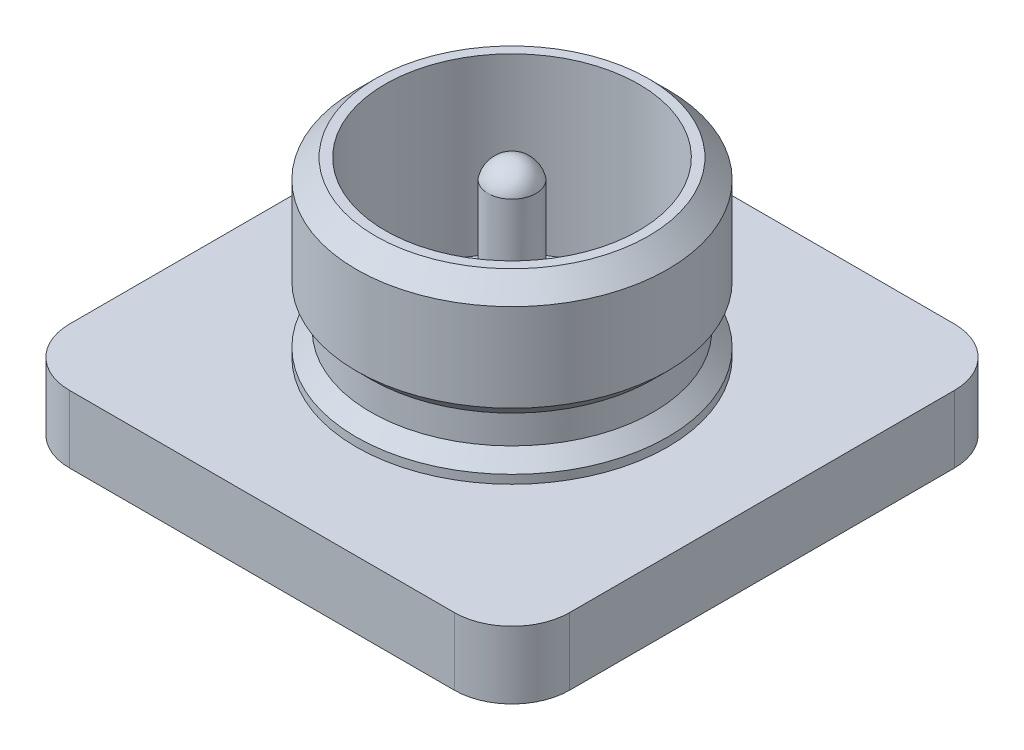
ISO-10303-21;
HEADER;
FILE_DESCRIPTION(('STEP AP214'),'2;1');
FILE_NAME('part.step','',(''),(''),'','','');
FILE_SCHEMA(('AUTOMOTIVE_DESIGN { 1 0 10303 214 1 1 1 1 }'));
ENDSEC;
DATA;
#1=APPLICATION_CONTEXT('core data for automotive mechanical design processes');
#2=APPLICATION_PROTOCOL_DEFINITION('international standard','automotive_design',2000,#1);
#3=PRODUCT_CONTEXT('',#1,'mechanical');
#4=PRODUCT('Part','Part','',(#3));
#5=PRODUCT_RELATED_PRODUCT_CATEGORY('part','',(#4));
#6=PRODUCT_DEFINITION_FORMATION('','',#4);
#7=PRODUCT_DEFINITION_CONTEXT('part definition',#1,'design');
#8=PRODUCT_DEFINITION('design','',#6,#7);
#9=PRODUCT_DEFINITION_SHAPE('','',#8);
#10=(LENGTH_UNIT() NAMED_UNIT(*) SI_UNIT(.MILLI.,.METRE.));
#11=(NAMED_UNIT(*) PLANE_ANGLE_UNIT() SI_UNIT($,.RADIAN.));
#12=(NAMED_UNIT(*) SI_UNIT($,.STERADIAN.) SOLID_ANGLE_UNIT());
#13=UNCERTAINTY_MEASURE_WITH_UNIT(LENGTH_MEASURE(1.E-05),#10,'distance_accuracy_value','');
#14=(GEOMETRIC_REPRESENTATION_CONTEXT(3) GLOBAL_UNCERTAINTY_ASSIGNED_CONTEXT((#13)) GLOBAL_UNIT_ASSIGNED_CONTEXT((#10,
#11,#12)) REPRESENTATION_CONTEXT('',''));
#15=CARTESIAN_POINT('',(0.,0.,0.));
#16=DIRECTION('',(0.,0.,1.));
#17=DIRECTION('',(1.,0.,0.));
#18=AXIS2_PLACEMENT_3D('',#15,#16,#17);
#19=CARTESIAN_POINT('',(0.,0.35,0.));
#20=DIRECTION('',(0.,-1.,0.));
#21=DIRECTION('',(0.,0.,-1.));
#22=AXIS2_PLACEMENT_3D('',#19,#20,#21);
#23=PLANE('',#22);
#24=CARTESIAN_POINT('',(0.,0.350000000000003,0.));
#25=DIRECTION('',(0.,-1.,0.));
#26=DIRECTION('',(0.,0.,-1.));
#27=AXIS2_PLACEMENT_3D('',#24,#25,#26);
#28=CIRCLE('',#27,0.659628486758379);
#29=CARTESIAN_POINT('',(0.,0.350000000000003,-0.659628486758379));
#30=VERTEX_POINT('',#29);
#31=EDGE_CURVE('E235',#30,#30,#28,.T.);
#32=ORIENTED_EDGE('',*,*,#31,.F.);
#33=EDGE_LOOP('',(#32));
#34=FACE_BOUND('',#33,.T.);
#35=CARTESIAN_POINT('',(0.,0.35,0.));
#36=DIRECTION('',(0.,-1.,0.));
#37=DIRECTION('',(0.,0.,-1.));
#38=AXIS2_PLACEMENT_3D('',#35,#36,#37);
#39=CIRCLE('',#38,0.125);
#40=CARTESIAN_POINT('',(0.,0.35,-0.125));
#41=VERTEX_POINT('',#40);
#42=EDGE_CURVE('E11',#41,#41,#39,.F.);
#43=ORIENTED_EDGE('',*,*,#42,.F.);
#44=EDGE_LOOP('',(#43));
#45=FACE_BOUND('',#44,.T.);
#46=ADVANCED_FACE('F33',(#34,#45),#23,.F.);
#47=CARTESIAN_POINT('',(1.3,0.35,1.3));
#48=DIRECTION('',(-1.,0.,0.));
#49=DIRECTION('',(0.,0.,1.));
#50=AXIS2_PLACEMENT_3D('',#47,#48,#49);
#51=PLANE('',#50);
#52=DIRECTION('',(0.,0.,-1.));
#53=VECTOR('',#52,1.);
#54=CARTESIAN_POINT('',(1.3,0.35,1.3));
#55=LINE('',#54,#53);
#56=CARTESIAN_POINT('',(1.3,0.35,1.));
#57=VERTEX_POINT('',#56);
#58=CARTESIAN_POINT('',(1.3,0.35,-1.));
#59=VERTEX_POINT('',#58);
#60=EDGE_CURVE('E127',#57,#59,#55,.T.);
#61=ORIENTED_EDGE('',*,*,#60,.F.);
#62=DIRECTION('',(0.,-1.,0.));
#63=VECTOR('',#62,1.);
#64=CARTESIAN_POINT('',(1.3,0.35,1.));
#65=LINE('',#64,#63);
#66=CARTESIAN_POINT('',(1.3,0.,1.));
#67=VERTEX_POINT('',#66);
#68=EDGE_CURVE('E153',#57,#67,#65,.T.);
#69=ORIENTED_EDGE('',*,*,#68,.T.);
#70=DIRECTION('',(0.,0.,-1.));
#71=VECTOR('',#70,1.);
#72=CARTESIAN_POINT('',(1.3,0.,1.3));
#73=LINE('',#72,#71);
#74=CARTESIAN_POINT('',(1.3,0.,-1.));
#75=VERTEX_POINT('',#74);
#76=EDGE_CURVE('E233',#67,#75,#73,.T.);
#77=ORIENTED_EDGE('',*,*,#76,.T.);
#78=DIRECTION('',(0.,-1.,0.));
#79=VECTOR('',#78,1.);
#80=CARTESIAN_POINT('',(1.3,0.35,-1.));
#81=LINE('',#80,#79);
#82=EDGE_CURVE('E151',#75,#59,#81,.F.);
#83=ORIENTED_EDGE('',*,*,#82,.T.);
#84=EDGE_LOOP('',(#61,#69,#77,#83));
#85=FACE_BOUND('',#84,.T.);
#86=ADVANCED_FACE('F197',(#85),#51,.F.);
#87=CARTESIAN_POINT('',(-1.3,0.35,-1.3));
#88=DIRECTION('',(0.,0.,1.));
#89=DIRECTION('',(1.,0.,0.));
#90=AXIS2_PLACEMENT_3D('',#87,#88,#89);
#91=PLANE('',#90);
#92=DIRECTION('',(-1.,0.,0.));
#93=VECTOR('',#92,1.);
#94=CARTESIAN_POINT('',(-1.3,0.35,-1.3));
#95=LINE('',#94,#93);
#96=CARTESIAN_POINT('',(1.,0.35,-1.3));
#97=VERTEX_POINT('',#96);
#98=CARTESIAN_POINT('',(-1.,0.35,-1.3));
#99=VERTEX_POINT('',#98);
#100=EDGE_CURVE('E130',#97,#99,#95,.T.);
#101=ORIENTED_EDGE('',*,*,#100,.F.);
#102=DIRECTION('',(0.,-1.,0.));
#103=VECTOR('',#102,1.);
#104=CARTESIAN_POINT('',(1.,0.35,-1.3));
#105=LINE('',#104,#103);
#106=CARTESIAN_POINT('',(1.,0.,-1.3));
#107=VERTEX_POINT('',#106);
#108=EDGE_CURVE('E157',#97,#107,#105,.T.);
#109=ORIENTED_EDGE('',*,*,#108,.T.);
#110=DIRECTION('',(-1.,0.,0.));
#111=VECTOR('',#110,1.);
#112=CARTESIAN_POINT('',(-1.3,0.,-1.3));
#113=LINE('',#112,#111);
#114=CARTESIAN_POINT('',(-1.,0.,-1.3));
#115=VERTEX_POINT('',#114);
#116=EDGE_CURVE('E132',#107,#115,#113,.T.);
#117=ORIENTED_EDGE('',*,*,#116,.T.);
#118=DIRECTION('',(0.,-1.,0.));
#119=VECTOR('',#118,1.);
#120=CARTESIAN_POINT('',(-1.,0.35,-1.3));
#121=LINE('',#120,#119);
#122=EDGE_CURVE('E49',#115,#99,#121,.F.);
#123=ORIENTED_EDGE('',*,*,#122,.T.);
#124=EDGE_LOOP('',(#101,#109,#117,#123));
#125=FACE_BOUND('',#124,.T.);
#126=ADVANCED_FACE('F204',(#125),#91,.F.);
#127=CARTESIAN_POINT('',(-1.3,0.35,1.3));
#128=DIRECTION('',(1.,0.,0.));
#129=DIRECTION('',(0.,0.,-1.));
#130=AXIS2_PLACEMENT_3D('',#127,#128,#129);
#131=PLANE('',#130);
#132=DIRECTION('',(0.,0.,1.));
#133=VECTOR('',#132,1.);
#134=CARTESIAN_POINT('',(-1.3,0.,1.3));
#135=LINE('',#134,#133);
#136=CARTESIAN_POINT('',(-1.3,0.,-1.));
#137=VERTEX_POINT('',#136);
#138=CARTESIAN_POINT('',(-1.3,0.,1.));
#139=VERTEX_POINT('',#138);
#140=EDGE_CURVE('E128',#137,#139,#135,.T.);
#141=ORIENTED_EDGE('',*,*,#140,.T.);
#142=DIRECTION('',(0.,-1.,0.));
#143=VECTOR('',#142,1.);
#144=CARTESIAN_POINT('',(-1.3,0.35,1.));
#145=LINE('',#144,#143);
#146=CARTESIAN_POINT('',(-1.3,0.35,1.));
#147=VERTEX_POINT('',#146);
#148=EDGE_CURVE('E106',#139,#147,#145,.F.);
#149=ORIENTED_EDGE('',*,*,#148,.T.);
#150=DIRECTION('',(0.,0.,1.));
#151=VECTOR('',#150,1.);
#152=CARTESIAN_POINT('',(-1.3,0.35,1.3));
#153=LINE('',#152,#151);
#154=CARTESIAN_POINT('',(-1.3,0.35,-1.));
#155=VERTEX_POINT('',#154);
#156=EDGE_CURVE('E225',#155,#147,#153,.T.);
#157=ORIENTED_EDGE('',*,*,#156,.F.);
#158=DIRECTION('',(0.,-1.,0.));
#159=VECTOR('',#158,1.);
#160=CARTESIAN_POINT('',(-1.3,0.35,-1.));
#161=LINE('',#160,#159);
#162=EDGE_CURVE('E111',#155,#137,#161,.T.);
#163=ORIENTED_EDGE('',*,*,#162,.T.);
#164=EDGE_LOOP('',(#141,#149,#157,#163));
#165=FACE_BOUND('',#164,.T.);
#166=ADVANCED_FACE('F218',(#165),#131,.F.);
#167=CARTESIAN_POINT('',(-1.3,0.35,1.3));
#168=DIRECTION('',(0.,0.,-1.));
#169=DIRECTION('',(-1.,0.,0.));
#170=AXIS2_PLACEMENT_3D('',#167,#168,#169);
#171=PLANE('',#170);
#172=DIRECTION('',(1.,0.,0.));
#173=VECTOR('',#172,1.);
#174=CARTESIAN_POINT('',(-1.3,0.35,1.3));
#175=LINE('',#174,#173);
#176=CARTESIAN_POINT('',(-1.,0.35,1.3));
#177=VERTEX_POINT('',#176);
#178=CARTESIAN_POINT('',(1.,0.35,1.3));
#179=VERTEX_POINT('',#178);
#180=EDGE_CURVE('E121',#177,#179,#175,.T.);
#181=ORIENTED_EDGE('',*,*,#180,.F.);
#182=DIRECTION('',(0.,-1.,0.));
#183=VECTOR('',#182,1.);
#184=CARTESIAN_POINT('',(-1.,0.35,1.3));
#185=LINE('',#184,#183);
#186=CARTESIAN_POINT('',(-1.,0.,1.3));
#187=VERTEX_POINT('',#186);
#188=EDGE_CURVE('E105',#177,#187,#185,.T.);
#189=ORIENTED_EDGE('',*,*,#188,.T.);
#190=DIRECTION('',(1.,0.,0.));
#191=VECTOR('',#190,1.);
#192=CARTESIAN_POINT('',(-1.3,0.,1.3));
#193=LINE('',#192,#191);
#194=CARTESIAN_POINT('',(1.,0.,1.3));
#195=VERTEX_POINT('',#194);
#196=EDGE_CURVE('E118',#187,#195,#193,.T.);
#197=ORIENTED_EDGE('',*,*,#196,.T.);
#198=DIRECTION('',(0.,-1.,0.));
#199=VECTOR('',#198,1.);
#200=CARTESIAN_POINT('',(1.,0.35,1.3));
#201=LINE('',#200,#199);
#202=EDGE_CURVE('E123',#195,#179,#201,.F.);
#203=ORIENTED_EDGE('',*,*,#202,.T.);
#204=EDGE_LOOP('',(#181,#189,#197,#203));
#205=FACE_BOUND('',#204,.T.);
#206=ADVANCED_FACE('F117',(#205),#171,.F.);
#207=CARTESIAN_POINT('',(0.,0.350000000000003,0.));
#208=DIRECTION('',(0.,-1.,0.));
#209=DIRECTION('',(0.,0.,-1.));
#210=AXIS2_PLACEMENT_3D('',#207,#208,#209);
#211=CIRCLE('',#210,0.809628486758379);
#212=CARTESIAN_POINT('',(0.,0.350000000000003,-0.809628486758379));
#213=VERTEX_POINT('',#212);
#214=EDGE_CURVE('E222',#213,#213,#211,.T.);
#215=ORIENTED_EDGE('',*,*,#214,.T.);
#216=EDGE_LOOP('',(#215));
#217=FACE_BOUND('',#216,.T.);
#218=ORIENTED_EDGE('',*,*,#156,.T.);
#219=CARTESIAN_POINT('',(-1.,0.35,1.));
#220=DIRECTION('',(0.,-1.,0.));
#221=DIRECTION('',(0.,0.,-1.));
#222=AXIS2_PLACEMENT_3D('',#219,#220,#221);
#223=CIRCLE('',#222,0.3);
#224=EDGE_CURVE('E149',#147,#177,#223,.F.);
#225=ORIENTED_EDGE('',*,*,#224,.T.);
#226=ORIENTED_EDGE('',*,*,#180,.T.);
#227=CARTESIAN_POINT('',(1.,0.35,1.));
#228=DIRECTION('',(0.,-1.,0.));
#229=DIRECTION('',(0.,0.,-1.));
#230=AXIS2_PLACEMENT_3D('',#227,#228,#229);
#231=CIRCLE('',#230,0.3);
#232=EDGE_CURVE('E147',#179,#57,#231,.F.);
#233=ORIENTED_EDGE('',*,*,#232,.T.);
#234=ORIENTED_EDGE('',*,*,#60,.T.);
#235=CARTESIAN_POINT('',(1.,0.35,-1.));
#236=DIRECTION('',(0.,-1.,0.));
#237=DIRECTION('',(0.,0.,-1.));
#238=AXIS2_PLACEMENT_3D('',#235,#236,#237);
#239=CIRCLE('',#238,0.3);
#240=EDGE_CURVE('E56',#59,#97,#239,.F.);
#241=ORIENTED_EDGE('',*,*,#240,.T.);
#242=ORIENTED_EDGE('',*,*,#100,.T.);
#243=CARTESIAN_POINT('',(-1.,0.35,-1.));
#244=DIRECTION('',(0.,-1.,0.));
#245=DIRECTION('',(0.,0.,-1.));
#246=AXIS2_PLACEMENT_3D('',#243,#244,#245);
#247=CIRCLE('',#246,0.3);
#248=EDGE_CURVE('E144',#99,#155,#247,.F.);
#249=ORIENTED_EDGE('',*,*,#248,.T.);
#250=EDGE_LOOP('',(#218,#225,#226,#233,#234,#241,#242,#249));
#251=FACE_BOUND('',#250,.T.);
#252=ADVANCED_FACE('F200',(#217,#251),#23,.F.);
#253=CARTESIAN_POINT('',(0.,0.,0.));
#254=DIRECTION('',(0.,-1.,0.));
#255=DIRECTION('',(0.,0.,-1.));
#256=AXIS2_PLACEMENT_3D('',#253,#254,#255);
#257=PLANE('',#256);
#258=CARTESIAN_POINT('',(0.,0.,0.));
#259=DIRECTION('',(0.,-1.,0.));
#260=DIRECTION('',(0.,0.,-1.));
#261=AXIS2_PLACEMENT_3D('',#258,#259,#260);
#262=CIRCLE('',#261,0.125);
#263=CARTESIAN_POINT('',(0.,0.,-0.125));
#264=VERTEX_POINT('',#263);
#265=EDGE_CURVE('E298',#264,#264,#262,.T.);
#266=ORIENTED_EDGE('',*,*,#265,.F.);
#267=EDGE_LOOP('',(#266));
#268=FACE_BOUND('',#267,.T.);
#269=ORIENTED_EDGE('',*,*,#196,.F.);
#270=CARTESIAN_POINT('',(-1.,0.,1.));
#271=DIRECTION('',(0.,-1.,0.));
#272=DIRECTION('',(0.,0.,-1.));
#273=AXIS2_PLACEMENT_3D('',#270,#271,#272);
#274=CIRCLE('',#273,0.3);
#275=EDGE_CURVE('E101',#187,#139,#274,.T.);
#276=ORIENTED_EDGE('',*,*,#275,.T.);
#277=ORIENTED_EDGE('',*,*,#140,.F.);
#278=CARTESIAN_POINT('',(-1.,0.,-1.));
#279=DIRECTION('',(0.,-1.,0.));
#280=DIRECTION('',(0.,0.,-1.));
#281=AXIS2_PLACEMENT_3D('',#278,#279,#280);
#282=CIRCLE('',#281,0.3);
#283=EDGE_CURVE('E122',#137,#115,#282,.T.);
#284=ORIENTED_EDGE('',*,*,#283,.T.);
#285=ORIENTED_EDGE('',*,*,#116,.F.);
#286=CARTESIAN_POINT('',(1.,0.,-1.));
#287=DIRECTION('',(0.,-1.,0.));
#288=DIRECTION('',(0.,0.,-1.));
#289=AXIS2_PLACEMENT_3D('',#286,#287,#288);
#290=CIRCLE('',#289,0.3);
#291=EDGE_CURVE('E138',#107,#75,#290,.T.);
#292=ORIENTED_EDGE('',*,*,#291,.T.);
#293=ORIENTED_EDGE('',*,*,#76,.F.);
#294=CARTESIAN_POINT('',(1.,0.,1.));
#295=DIRECTION('',(0.,-1.,0.));
#296=DIRECTION('',(0.,0.,-1.));
#297=AXIS2_PLACEMENT_3D('',#294,#295,#296);
#298=CIRCLE('',#297,0.3);
#299=EDGE_CURVE('E112',#67,#195,#298,.T.);
#300=ORIENTED_EDGE('',*,*,#299,.T.);
#301=EDGE_LOOP('',(#269,#276,#277,#284,#285,#292,#293,#300));
#302=FACE_BOUND('',#301,.T.);
#303=ADVANCED_FACE('F125',(#268,#302),#257,.T.);
#304=CARTESIAN_POINT('',(-1.,0.35,1.));
#305=DIRECTION('',(0.,-1.,0.));
#306=DIRECTION('',(0.,0.,-1.));
#307=AXIS2_PLACEMENT_3D('',#304,#305,#306);
#308=CYLINDRICAL_SURFACE('',#307,0.3);
#309=ORIENTED_EDGE('',*,*,#224,.F.);
#310=ORIENTED_EDGE('',*,*,#148,.F.);
#311=ORIENTED_EDGE('',*,*,#275,.F.);
#312=ORIENTED_EDGE('',*,*,#188,.F.);
#313=EDGE_LOOP('',(#309,#310,#311,#312));
#314=FACE_BOUND('',#313,.T.);
#315=ADVANCED_FACE('F104',(#314),#308,.T.);
#316=CARTESIAN_POINT('',(1.,0.35,1.));
#317=DIRECTION('',(0.,-1.,0.));
#318=DIRECTION('',(0.,0.,-1.));
#319=AXIS2_PLACEMENT_3D('',#316,#317,#318);
#320=CYLINDRICAL_SURFACE('',#319,0.3);
#321=ORIENTED_EDGE('',*,*,#232,.F.);
#322=ORIENTED_EDGE('',*,*,#202,.F.);
#323=ORIENTED_EDGE('',*,*,#299,.F.);
#324=ORIENTED_EDGE('',*,*,#68,.F.);
#325=EDGE_LOOP('',(#321,#322,#323,#324));
#326=FACE_BOUND('',#325,.T.);
#327=ADVANCED_FACE('F249',(#326),#320,.T.);
#328=CARTESIAN_POINT('',(1.,0.35,-1.));
#329=DIRECTION('',(0.,-1.,0.));
#330=DIRECTION('',(0.,0.,-1.));
#331=AXIS2_PLACEMENT_3D('',#328,#329,#330);
#332=CYLINDRICAL_SURFACE('',#331,0.3);
#333=ORIENTED_EDGE('',*,*,#240,.F.);
#334=ORIENTED_EDGE('',*,*,#82,.F.);
#335=ORIENTED_EDGE('',*,*,#291,.F.);
#336=ORIENTED_EDGE('',*,*,#108,.F.);
#337=EDGE_LOOP('',(#333,#334,#335,#336));
#338=FACE_BOUND('',#337,.T.);
#339=ADVANCED_FACE('F252',(#338),#332,.T.);
#340=CARTESIAN_POINT('',(-1.,0.35,-1.));
#341=DIRECTION('',(0.,-1.,0.));
#342=DIRECTION('',(0.,0.,-1.));
#343=AXIS2_PLACEMENT_3D('',#340,#341,#342);
#344=CYLINDRICAL_SURFACE('',#343,0.3);
#345=ORIENTED_EDGE('',*,*,#248,.F.);
#346=ORIENTED_EDGE('',*,*,#122,.F.);
#347=ORIENTED_EDGE('',*,*,#283,.F.);
#348=ORIENTED_EDGE('',*,*,#162,.F.);
#349=EDGE_LOOP('',(#345,#346,#347,#348));
#350=FACE_BOUND('',#349,.T.);
#351=ADVANCED_FACE('F239',(#350),#344,.T.);
#352=CARTESIAN_POINT('',(0.,-50.,0.));
#353=DIRECTION('',(0.,-1.,0.));
#354=DIRECTION('',(0.,0.,-1.));
#355=AXIS2_PLACEMENT_3D('',#352,#353,#354);
#356=CYLINDRICAL_SURFACE('',#355,0.659628486758379);
#357=ORIENTED_EDGE('',*,*,#31,.T.);
#358=EDGE_LOOP('',(#357));
#359=FACE_BOUND('',#358,.T.);
#360=CARTESIAN_POINT('',(0.,1.25,0.));
#361=DIRECTION('',(0.,-1.,0.));
#362=DIRECTION('',(0.,0.,-1.));
#363=AXIS2_PLACEMENT_3D('',#360,#361,#362);
#364=CIRCLE('',#363,0.659628486758379);
#365=CARTESIAN_POINT('',(0.,1.25,-0.659628486758379));
#366=VERTEX_POINT('',#365);
#367=EDGE_CURVE('E292',#366,#366,#364,.T.);
#368=ORIENTED_EDGE('',*,*,#367,.F.);
#369=EDGE_LOOP('',(#368));
#370=FACE_BOUND('',#369,.T.);
#371=ADVANCED_FACE('F259',(#359,#370),#356,.F.);
#372=CARTESIAN_POINT('',(0.659628486758379,1.25,0.));
#373=DIRECTION('',(0.,1.,0.));
#374=DIRECTION('',(0.,0.,1.));
#375=AXIS2_PLACEMENT_3D('',#372,#373,#374);
#376=PLANE('',#375);
#377=CARTESIAN_POINT('',(0.,1.25,0.));
#378=DIRECTION('',(0.,1.,0.));
#379=DIRECTION('',(0.,0.,1.));
#380=AXIS2_PLACEMENT_3D('',#377,#378,#379);
#381=CIRCLE('',#380,0.709628486758377);
#382=CARTESIAN_POINT('',(0.,1.25,0.709628486758377));
#383=VERTEX_POINT('',#382);
#384=EDGE_CURVE('E163',#383,#383,#381,.T.);
#385=ORIENTED_EDGE('',*,*,#384,.T.);
#386=EDGE_LOOP('',(#385));
#387=FACE_BOUND('',#386,.T.);
#388=ORIENTED_EDGE('',*,*,#367,.T.);
#389=EDGE_LOOP('',(#388));
#390=FACE_BOUND('',#389,.T.);
#391=ADVANCED_FACE('F274',(#387,#390),#376,.T.);
#392=CARTESIAN_POINT('',(0.,-50.,0.));
#393=DIRECTION('',(0.,-1.,0.));
#394=DIRECTION('',(0.,0.,-1.));
#395=AXIS2_PLACEMENT_3D('',#392,#393,#394);
#396=CYLINDRICAL_SURFACE('',#395,0.809628486758379);
#397=CARTESIAN_POINT('',(0.,0.69252426350587,0.));
#398=DIRECTION('',(0.,-1.,0.));
#399=DIRECTION('',(0.,0.,-1.));
#400=AXIS2_PLACEMENT_3D('',#397,#398,#399);
#401=CIRCLE('',#400,0.809628486758379);
#402=CARTESIAN_POINT('',(0.,0.69252426350587,-0.809628486758379));
#403=VERTEX_POINT('',#402);
#404=EDGE_CURVE('E169',#403,#403,#401,.F.);
#405=ORIENTED_EDGE('',*,*,#404,.T.);
#406=EDGE_LOOP('',(#405));
#407=FACE_BOUND('',#406,.T.);
#408=CARTESIAN_POINT('',(0.,1.15,0.));
#409=DIRECTION('',(0.,1.,0.));
#410=DIRECTION('',(0.,0.,1.));
#411=AXIS2_PLACEMENT_3D('',#408,#409,#410);
#412=CIRCLE('',#411,0.809628486758379);
#413=CARTESIAN_POINT('',(0.,1.15,0.809628486758379));
#414=VERTEX_POINT('',#413);
#415=EDGE_CURVE('E160',#414,#414,#412,.F.);
#416=ORIENTED_EDGE('',*,*,#415,.T.);
#417=EDGE_LOOP('',(#416));
#418=FACE_BOUND('',#417,.T.);
#419=ADVANCED_FACE('F272',(#407,#418),#396,.T.);
#420=CARTESIAN_POINT('',(0.,-50.,0.));
#421=DIRECTION('',(0.,-1.,0.));
#422=DIRECTION('',(0.,0.,-1.));
#423=AXIS2_PLACEMENT_3D('',#420,#421,#422);
#424=CYLINDRICAL_SURFACE('',#423,0.734628486758379);
#425=CARTESIAN_POINT('',(0.,0.617524263505874,0.));
#426=DIRECTION('',(0.,1.,0.));
#427=DIRECTION('',(0.,0.,1.));
#428=AXIS2_PLACEMENT_3D('',#425,#426,#427);
#429=CIRCLE('',#428,0.734628486758379);
#430=CARTESIAN_POINT('',(0.,0.617524263505874,0.734628486758379));
#431=VERTEX_POINT('',#430);
#432=EDGE_CURVE('E42',#431,#431,#429,.F.);
#433=ORIENTED_EDGE('',*,*,#432,.T.);
#434=EDGE_LOOP('',(#433));
#435=FACE_BOUND('',#434,.T.);
#436=CARTESIAN_POINT('',(0.,0.469723206899582,0.));
#437=DIRECTION('',(0.,-1.,0.));
#438=DIRECTION('',(0.,0.,-1.));
#439=AXIS2_PLACEMENT_3D('',#436,#437,#438);
#440=CIRCLE('',#439,0.734628486758379);
#441=CARTESIAN_POINT('',(0.,0.469723206899582,-0.734628486758379));
#442=VERTEX_POINT('',#441);
#443=EDGE_CURVE('E172',#442,#442,#440,.F.);
#444=ORIENTED_EDGE('',*,*,#443,.T.);
#445=EDGE_LOOP('',(#444));
#446=FACE_BOUND('',#445,.T.);
#447=ADVANCED_FACE('F178',(#435,#446),#424,.T.);
#448=CARTESIAN_POINT('',(0.,-50.,0.));
#449=DIRECTION('',(0.,-1.,0.));
#450=DIRECTION('',(0.,0.,-1.));
#451=AXIS2_PLACEMENT_3D('',#448,#449,#450);
#452=CYLINDRICAL_SURFACE('',#451,0.809628486758379);
#453=CARTESIAN_POINT('',(0.,0.39472320689958,0.));
#454=DIRECTION('',(0.,1.,0.));
#455=DIRECTION('',(0.,0.,1.));
#456=AXIS2_PLACEMENT_3D('',#453,#454,#455);
#457=CIRCLE('',#456,0.809628486758379);
#458=CARTESIAN_POINT('',(0.,0.39472320689958,0.809628486758379));
#459=VERTEX_POINT('',#458);
#460=EDGE_CURVE('E166',#459,#459,#457,.F.);
#461=ORIENTED_EDGE('',*,*,#460,.T.);
#462=EDGE_LOOP('',(#461));
#463=FACE_BOUND('',#462,.T.);
#464=ORIENTED_EDGE('',*,*,#214,.F.);
#465=EDGE_LOOP('',(#464));
#466=FACE_BOUND('',#465,.T.);
#467=ADVANCED_FACE('F261',(#463,#466),#452,.T.);
#468=CARTESIAN_POINT('',(0.,1.15,0.));
#469=DIRECTION('',(0.,-1.,0.));
#470=DIRECTION('',(0.,0.,-1.));
#471=AXIS2_PLACEMENT_3D('',#468,#469,#470);
#472=CONICAL_SURFACE('',#471,0.809628486758379,0.785398163397448);
#473=ORIENTED_EDGE('',*,*,#384,.F.);
#474=EDGE_LOOP('',(#473));
#475=FACE_BOUND('',#474,.T.);
#476=ORIENTED_EDGE('',*,*,#415,.F.);
#477=EDGE_LOOP('',(#476));
#478=FACE_BOUND('',#477,.T.);
#479=ADVANCED_FACE('F192',(#475,#478),#472,.T.);
#480=CARTESIAN_POINT('',(0.,0.39472320689958,0.));
#481=DIRECTION('',(0.,-1.,0.));
#482=DIRECTION('',(0.,0.,-1.));
#483=AXIS2_PLACEMENT_3D('',#480,#481,#482);
#484=CONICAL_SURFACE('',#483,0.809628486758379,0.785398163397438);
#485=ORIENTED_EDGE('',*,*,#443,.F.);
#486=EDGE_LOOP('',(#485));
#487=FACE_BOUND('',#486,.T.);
#488=ORIENTED_EDGE('',*,*,#460,.F.);
#489=EDGE_LOOP('',(#488));
#490=FACE_BOUND('',#489,.T.);
#491=ADVANCED_FACE('F184',(#487,#490),#484,.T.);
#492=CARTESIAN_POINT('',(0.,0.592524263505874,0.));
#493=DIRECTION('',(0.,1.,0.));
#494=DIRECTION('',(0.,0.,1.));
#495=AXIS2_PLACEMENT_3D('',#492,#493,#494);
#496=CONICAL_SURFACE('',#495,0.709628486758377,0.785398163397478);
#497=ORIENTED_EDGE('',*,*,#404,.F.);
#498=EDGE_LOOP('',(#497));
#499=FACE_BOUND('',#498,.T.);
#500=ORIENTED_EDGE('',*,*,#432,.F.);
#501=EDGE_LOOP('',(#500));
#502=FACE_BOUND('',#501,.T.);
#503=ADVANCED_FACE('F181',(#499,#502),#496,.T.);
#504=CARTESIAN_POINT('',(0.,1.15,0.));
#505=DIRECTION('',(0.,-1.,0.));
#506=DIRECTION('',(0.,0.,-1.));
#507=AXIS2_PLACEMENT_3D('',#504,#505,#506);
#508=CYLINDRICAL_SURFACE('',#507,0.125);
#509=CARTESIAN_POINT('',(0.,1.15,0.));
#510=DIRECTION('',(0.,1.,0.));
#511=DIRECTION('',(0.,0.,1.));
#512=AXIS2_PLACEMENT_3D('',#509,#510,#511);
#513=CIRCLE('',#512,0.125);
#514=CARTESIAN_POINT('',(0.,1.15,0.125));
#515=VERTEX_POINT('',#514);
#516=EDGE_CURVE('E37',#515,#515,#513,.T.);
#517=ORIENTED_EDGE('',*,*,#516,.F.);
#518=EDGE_LOOP('',(#517));
#519=FACE_BOUND('',#518,.T.);
#520=ORIENTED_EDGE('',*,*,#42,.T.);
#521=EDGE_LOOP('',(#520));
#522=FACE_BOUND('',#521,.T.);
#523=ADVANCED_FACE('F183',(#519,#522),#508,.T.);
#524=CARTESIAN_POINT('',(0.,1.121875,0.));
#525=DIRECTION('',(0.,0.,1.));
#526=DIRECTION('',(1.,0.,0.));
#527=AXIS2_PLACEMENT_3D('',#524,#525,#526);
#528=SPHERICAL_SURFACE('',#527,0.128125);
#529=CARTESIAN_POINT('',(0.,1.121875,0.));
#530=DIRECTION('',(0.,1.,0.));
#531=DIRECTION('',(0.,0.,1.));
#532=AXIS2_PLACEMENT_3D('',#529,#530,#531);
#533=SPHERICAL_SURFACE('',#532,0.128125);
#534=ORIENTED_EDGE('',*,*,#516,.T.);
#535=EDGE_LOOP('',(#534));
#536=FACE_BOUND('',#535,.T.);
#537=ADVANCED_FACE('F35',(#536),#533,.T.);
#538=CARTESIAN_POINT('',(0.,0.34,0.));
#539=DIRECTION('',(0.,-1.,0.));
#540=DIRECTION('',(0.,0.,-1.));
#541=AXIS2_PLACEMENT_3D('',#538,#539,#540);
#542=CYLINDRICAL_SURFACE('',#541,0.125);
#543=CARTESIAN_POINT('',(0.,0.34,0.));
#544=DIRECTION('',(0.,-1.,0.));
#545=DIRECTION('',(0.,0.,-1.));
#546=AXIS2_PLACEMENT_3D('',#543,#544,#545);
#547=CIRCLE('',#546,0.125);
#548=CARTESIAN_POINT('',(0.,0.34,-0.125));
#549=VERTEX_POINT('',#548);
#550=EDGE_CURVE('E301',#549,#549,#547,.T.);
#551=ORIENTED_EDGE('',*,*,#550,.F.);
#552=EDGE_LOOP('',(#551));
#553=FACE_BOUND('',#552,.T.);
#554=ORIENTED_EDGE('',*,*,#265,.T.);
#555=EDGE_LOOP('',(#554));
#556=FACE_BOUND('',#555,.T.);
#557=ADVANCED_FACE('F311',(#553,#556),#542,.F.);
#558=CARTESIAN_POINT('',(0.,0.34,0.));
#559=DIRECTION('',(0.,-1.,0.));
#560=DIRECTION('',(0.,0.,-1.));
#561=AXIS2_PLACEMENT_3D('',#558,#559,#560);
#562=PLANE('',#561);
#563=ORIENTED_EDGE('',*,*,#550,.T.);
#564=EDGE_LOOP('',(#563));
#565=FACE_BOUND('',#564,.T.);
#566=ADVANCED_FACE('F315',(#565),#562,.T.);
#567=CLOSED_SHELL('',(#46,#86,#126,#166,#206,#252,#303,#315,#327,#339,#351,#371,#391,#419,#447,
#467,#479,#491,#503,#523,#537,#557,#566));
#568=MANIFOLD_SOLID_BREP('B2',#567);
#569=ADVANCED_BREP_SHAPE_REPRESENTATION('',(#18,#568),#14);
#570=SHAPE_DEFINITION_REPRESENTATION(#9,#569);
ENDSEC;
END-ISO-10303-21;
